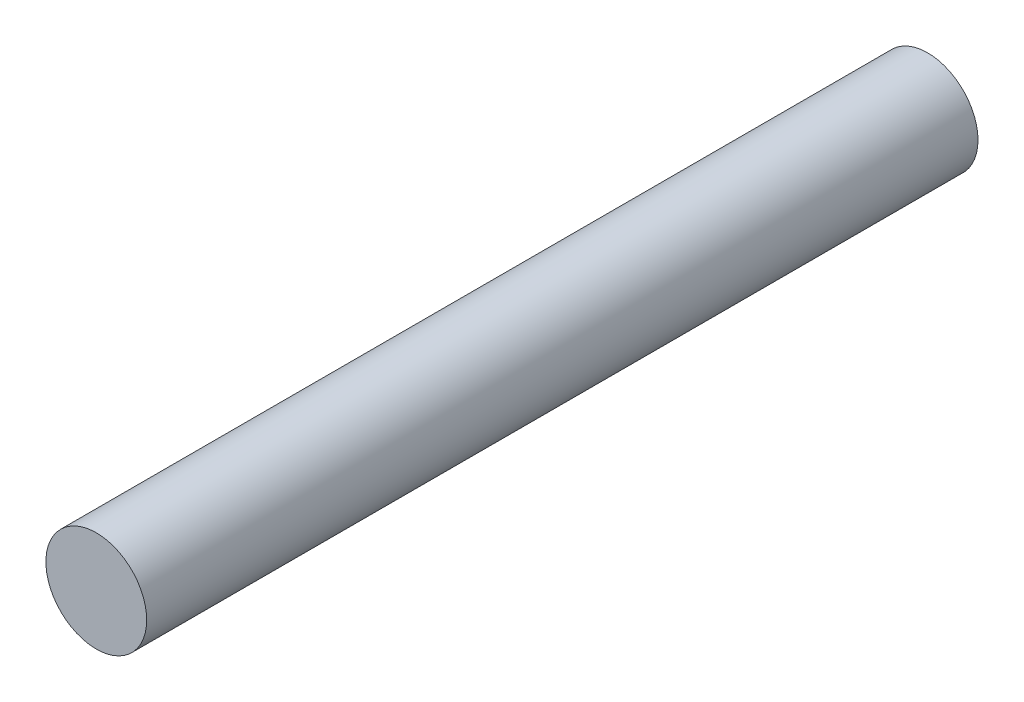
ISO-10303-21;
HEADER;
FILE_DESCRIPTION(('STEP AP214'),'2;1');
FILE_NAME('part.step','',(''),(''),'','','');
FILE_SCHEMA(('AUTOMOTIVE_DESIGN { 1 0 10303 214 1 1 1 1 }'));
ENDSEC;
DATA;
#1=APPLICATION_CONTEXT('core data for automotive mechanical design processes');
#2=APPLICATION_PROTOCOL_DEFINITION('international standard','automotive_design',2000,#1);
#3=PRODUCT_CONTEXT('',#1,'mechanical');
#4=PRODUCT('Part','Part','',(#3));
#5=PRODUCT_RELATED_PRODUCT_CATEGORY('part','',(#4));
#6=PRODUCT_DEFINITION_FORMATION('','',#4);
#7=PRODUCT_DEFINITION_CONTEXT('part definition',#1,'design');
#8=PRODUCT_DEFINITION('design','',#6,#7);
#9=PRODUCT_DEFINITION_SHAPE('','',#8);
#10=(LENGTH_UNIT() NAMED_UNIT(*) SI_UNIT(.MILLI.,.METRE.));
#11=(NAMED_UNIT(*) PLANE_ANGLE_UNIT() SI_UNIT($,.RADIAN.));
#12=(NAMED_UNIT(*) SI_UNIT($,.STERADIAN.) SOLID_ANGLE_UNIT());
#13=UNCERTAINTY_MEASURE_WITH_UNIT(LENGTH_MEASURE(1.E-05),#10,'distance_accuracy_value','');
#14=(GEOMETRIC_REPRESENTATION_CONTEXT(3) GLOBAL_UNCERTAINTY_ASSIGNED_CONTEXT((#13)) GLOBAL_UNIT_ASSIGNED_CONTEXT((#10,
#11,#12)) REPRESENTATION_CONTEXT('',''));
#15=CARTESIAN_POINT('',(0.,0.,0.));
#16=DIRECTION('',(0.,0.,1.));
#17=DIRECTION('',(1.,0.,0.));
#18=AXIS2_PLACEMENT_3D('',#15,#16,#17);
#19=CARTESIAN_POINT('',(0.,0.,66.));
#20=DIRECTION('',(0.,0.,-1.));
#21=DIRECTION('',(-1.,0.,0.));
#22=AXIS2_PLACEMENT_3D('',#19,#20,#21);
#23=CYLINDRICAL_SURFACE('',#22,4.);
#24=CARTESIAN_POINT('',(0.,0.,66.));
#25=DIRECTION('',(0.,0.,1.));
#26=DIRECTION('',(1.,0.,0.));
#27=AXIS2_PLACEMENT_3D('',#24,#25,#26);
#28=CIRCLE('',#27,4.);
#29=CARTESIAN_POINT('',(4.,0.,66.));
#30=VERTEX_POINT('',#29);
#31=EDGE_CURVE('E10',#30,#30,#28,.T.);
#32=ORIENTED_EDGE('',*,*,#31,.F.);
#33=EDGE_LOOP('',(#32));
#34=FACE_BOUND('',#33,.T.);
#35=CARTESIAN_POINT('',(0.,0.,0.));
#36=DIRECTION('',(0.,0.,1.));
#37=DIRECTION('',(1.,0.,0.));
#38=AXIS2_PLACEMENT_3D('',#35,#36,#37);
#39=CIRCLE('',#38,4.);
#40=CARTESIAN_POINT('',(4.,0.,0.));
#41=VERTEX_POINT('',#40);
#42=EDGE_CURVE('E36',#41,#41,#39,.T.);
#43=ORIENTED_EDGE('',*,*,#42,.T.);
#44=EDGE_LOOP('',(#43));
#45=FACE_BOUND('',#44,.T.);
#46=ADVANCED_FACE('F33',(#34,#45),#23,.T.);
#47=CARTESIAN_POINT('',(0.,0.,66.));
#48=DIRECTION('',(0.,0.,1.));
#49=DIRECTION('',(1.,0.,0.));
#50=AXIS2_PLACEMENT_3D('',#47,#48,#49);
#51=PLANE('',#50);
#52=ORIENTED_EDGE('',*,*,#31,.T.);
#53=EDGE_LOOP('',(#52));
#54=FACE_BOUND('',#53,.T.);
#55=ADVANCED_FACE('F48',(#54),#51,.T.);
#56=CARTESIAN_POINT('',(0.,0.,0.));
#57=DIRECTION('',(0.,0.,1.));
#58=DIRECTION('',(1.,0.,0.));
#59=AXIS2_PLACEMENT_3D('',#56,#57,#58);
#60=PLANE('',#59);
#61=ORIENTED_EDGE('',*,*,#42,.F.);
#62=EDGE_LOOP('',(#61));
#63=FACE_BOUND('',#62,.T.);
#64=ADVANCED_FACE('F46',(#63),#60,.F.);
#65=CLOSED_SHELL('',(#46,#55,#64));
#66=MANIFOLD_SOLID_BREP('B2',#65);
#67=ADVANCED_BREP_SHAPE_REPRESENTATION('',(#18,#66),#14);
#68=SHAPE_DEFINITION_REPRESENTATION(#9,#67);
ENDSEC;
END-ISO-10303-21;
